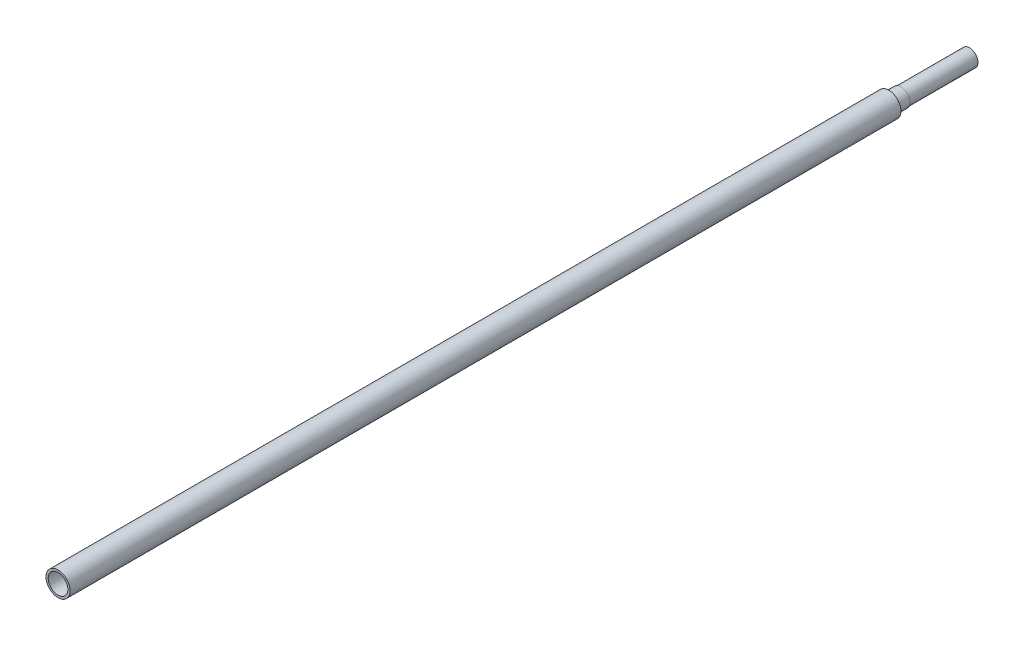
ISO-10303-21;
HEADER;
FILE_DESCRIPTION(('STEP AP214'),'2;1');
FILE_NAME('part.step','',(''),(''),'','','');
FILE_SCHEMA(('AUTOMOTIVE_DESIGN { 1 0 10303 214 1 1 1 1 }'));
ENDSEC;
DATA;
#1=APPLICATION_CONTEXT('core data for automotive mechanical design processes');
#2=APPLICATION_PROTOCOL_DEFINITION('international standard','automotive_design',2000,#1);
#3=PRODUCT_CONTEXT('',#1,'mechanical');
#4=PRODUCT('Part','Part','',(#3));
#5=PRODUCT_RELATED_PRODUCT_CATEGORY('part','',(#4));
#6=PRODUCT_DEFINITION_FORMATION('','',#4);
#7=PRODUCT_DEFINITION_CONTEXT('part definition',#1,'design');
#8=PRODUCT_DEFINITION('design','',#6,#7);
#9=PRODUCT_DEFINITION_SHAPE('','',#8);
#10=(LENGTH_UNIT() NAMED_UNIT(*) SI_UNIT(.MILLI.,.METRE.));
#11=(NAMED_UNIT(*) PLANE_ANGLE_UNIT() SI_UNIT($,.RADIAN.));
#12=(NAMED_UNIT(*) SI_UNIT($,.STERADIAN.) SOLID_ANGLE_UNIT());
#13=UNCERTAINTY_MEASURE_WITH_UNIT(LENGTH_MEASURE(1.E-05),#10,'distance_accuracy_value','');
#14=(GEOMETRIC_REPRESENTATION_CONTEXT(3) GLOBAL_UNCERTAINTY_ASSIGNED_CONTEXT((#13)) GLOBAL_UNIT_ASSIGNED_CONTEXT((#10,
#11,#12)) REPRESENTATION_CONTEXT('',''));
#15=CARTESIAN_POINT('',(0.,0.,0.));
#16=DIRECTION('',(0.,0.,1.));
#17=DIRECTION('',(1.,0.,0.));
#18=AXIS2_PLACEMENT_3D('',#15,#16,#17);
#19=CARTESIAN_POINT('',(0.,0.,57.));
#20=DIRECTION('',(0.,0.,-1.));
#21=DIRECTION('',(-1.,0.,0.));
#22=AXIS2_PLACEMENT_3D('',#19,#20,#21);
#23=CYLINDRICAL_SURFACE('',#22,7.);
#24=CARTESIAN_POINT('',(0.,0.,57.));
#25=DIRECTION('',(0.,0.,1.));
#26=DIRECTION('',(1.,0.,0.));
#27=AXIS2_PLACEMENT_3D('',#24,#25,#26);
#28=CIRCLE('',#27,7.);
#29=CARTESIAN_POINT('',(-7.,0.,57.));
#30=VERTEX_POINT('',#29);
#31=EDGE_CURVE('E11',#30,#30,#28,.T.);
#32=CARTESIAN_POINT('',(0.,0.,0.));
#33=DIRECTION('',(0.,0.,1.));
#34=DIRECTION('',(1.,0.,0.));
#35=AXIS2_PLACEMENT_3D('',#32,#33,#34);
#36=CIRCLE('',#35,7.);
#37=CARTESIAN_POINT('',(-7.,0.,0.));
#38=VERTEX_POINT('',#37);
#39=EDGE_CURVE('E48',#38,#38,#36,.T.);
#40=CARTESIAN_POINT('',(-7.,0.,57.));
#41=CARTESIAN_POINT('',(-7.,0.,56.40625));
#42=CARTESIAN_POINT('',(-7.,0.,55.8125));
#43=CARTESIAN_POINT('',(-7.,0.,54.625));
#44=CARTESIAN_POINT('',(-7.,0.,54.03125));
#45=CARTESIAN_POINT('',(-7.,0.,52.84375));
#46=CARTESIAN_POINT('',(-7.,0.,52.25));
#47=CARTESIAN_POINT('',(-7.,0.,51.0625));
#48=CARTESIAN_POINT('',(-7.,0.,50.46875));
#49=CARTESIAN_POINT('',(-7.,0.,49.28125));
#50=CARTESIAN_POINT('',(-7.,0.,48.6875));
#51=CARTESIAN_POINT('',(-7.,0.,47.5));
#52=CARTESIAN_POINT('',(-7.,0.,46.90625));
#53=CARTESIAN_POINT('',(-7.,0.,45.71875));
#54=CARTESIAN_POINT('',(-7.,0.,45.125));
#55=CARTESIAN_POINT('',(-7.,0.,43.9375));
#56=CARTESIAN_POINT('',(-7.,0.,43.34375));
#57=CARTESIAN_POINT('',(-7.,0.,42.15625));
#58=CARTESIAN_POINT('',(-7.,0.,41.5625));
#59=CARTESIAN_POINT('',(-7.,0.,40.375));
#60=CARTESIAN_POINT('',(-7.,0.,39.78125));
#61=CARTESIAN_POINT('',(-7.,0.,38.59375));
#62=CARTESIAN_POINT('',(-7.,0.,38.));
#63=CARTESIAN_POINT('',(-7.,0.,36.8125));
#64=CARTESIAN_POINT('',(-7.,0.,36.21875));
#65=CARTESIAN_POINT('',(-7.,0.,35.03125));
#66=CARTESIAN_POINT('',(-7.,0.,34.4375));
#67=CARTESIAN_POINT('',(-7.,0.,33.25));
#68=CARTESIAN_POINT('',(-7.,0.,32.65625));
#69=CARTESIAN_POINT('',(-7.,0.,31.46875));
#70=CARTESIAN_POINT('',(-7.,0.,30.875));
#71=CARTESIAN_POINT('',(-7.,0.,29.6875));
#72=CARTESIAN_POINT('',(-7.,0.,29.09375));
#73=CARTESIAN_POINT('',(-7.,0.,27.90625));
#74=CARTESIAN_POINT('',(-7.,0.,27.3125));
#75=CARTESIAN_POINT('',(-7.,0.,26.125));
#76=CARTESIAN_POINT('',(-7.,0.,25.53125));
#77=CARTESIAN_POINT('',(-7.,0.,24.34375));
#78=CARTESIAN_POINT('',(-7.,0.,23.75));
#79=CARTESIAN_POINT('',(-7.,0.,22.5625));
#80=CARTESIAN_POINT('',(-7.,0.,21.96875));
#81=CARTESIAN_POINT('',(-7.,0.,20.78125));
#82=CARTESIAN_POINT('',(-7.,0.,20.1875));
#83=CARTESIAN_POINT('',(-7.,0.,19.));
#84=CARTESIAN_POINT('',(-7.,0.,18.40625));
#85=CARTESIAN_POINT('',(-7.,0.,17.21875));
#86=CARTESIAN_POINT('',(-7.,0.,16.625));
#87=CARTESIAN_POINT('',(-7.,0.,15.4375));
#88=CARTESIAN_POINT('',(-7.,0.,14.84375));
#89=CARTESIAN_POINT('',(-7.,0.,13.65625));
#90=CARTESIAN_POINT('',(-7.,0.,13.0625));
#91=CARTESIAN_POINT('',(-7.,0.,11.875));
#92=CARTESIAN_POINT('',(-7.,0.,11.28125));
#93=CARTESIAN_POINT('',(-7.,0.,10.09375));
#94=CARTESIAN_POINT('',(-7.,0.,9.5));
#95=CARTESIAN_POINT('',(-7.,0.,8.3125));
#96=CARTESIAN_POINT('',(-7.,0.,7.71875));
#97=CARTESIAN_POINT('',(-7.,0.,6.53125));
#98=CARTESIAN_POINT('',(-7.,0.,5.9375));
#99=CARTESIAN_POINT('',(-7.,0.,4.75));
#100=CARTESIAN_POINT('',(-7.,0.,4.15625));
#101=CARTESIAN_POINT('',(-7.,0.,2.96875));
#102=CARTESIAN_POINT('',(-7.,0.,2.375));
#103=CARTESIAN_POINT('',(-7.,0.,1.1875));
#104=CARTESIAN_POINT('',(-7.,0.,0.593749999999999));
#105=CARTESIAN_POINT('',(-7.,0.,0.));
#106=B_SPLINE_CURVE_WITH_KNOTS('',3,(#40,#41,#42,#43,#44,#45,#46,#47,#48,#49,#50,#51,#52,#53,
#54,#55,#56,#57,#58,#59,#60,#61,#62,#63,#64,#65,#66,#67,#68,#69,#70,#71,#72,#73,#74,#75,#76,#77,
#78,#79,#80,#81,#82,#83,#84,#85,#86,#87,#88,#89,#90,#91,#92,#93,#94,#95,#96,#97,#98,#99,#100,
#101,#102,#103,#104,#105),.UNSPECIFIED.,.F.,.F.,(4,2,2,2,2,2,2,2,2,2,2,2,2,2,2,2,2,2,2,2,2,2,2,
2,2,2,2,2,2,2,2,2,4),(0.,1.78125,3.5625,5.34374999999999,7.12499999999999,8.90625,10.6875,
12.46875,14.25,16.03125,17.8125,19.59375,21.375,23.15625,24.9375,26.71875,28.5,30.28125,32.0625,
33.84375,35.625,37.40625,39.1875,40.96875,42.75,44.53125,46.3125,48.09375,49.875,51.65625,
53.4375,55.21875,57.),.UNSPECIFIED.);
#107=EDGE_CURVE('BSEAM41',#30,#38,#106,.T.);
#108=ORIENTED_EDGE('',*,*,#31,.F.);
#109=ORIENTED_EDGE('',*,*,#39,.T.);
#110=ORIENTED_EDGE('',*,*,#107,.T.);
#111=ORIENTED_EDGE('',*,*,#107,.F.);
#112=EDGE_LOOP('',(#108,#110,#109,#111));
#113=FACE_BOUND('',#112,.T.);
#114=ADVANCED_FACE('F41',(#113),#23,.T.);
#115=CARTESIAN_POINT('',(0.,0.,0.));
#116=DIRECTION('',(0.,0.,1.));
#117=DIRECTION('',(1.,0.,0.));
#118=AXIS2_PLACEMENT_3D('',#115,#116,#117);
#119=PLANE('',#118);
#120=ORIENTED_EDGE('',*,*,#39,.F.);
#121=EDGE_LOOP('',(#120));
#122=FACE_BOUND('',#121,.T.);
#123=ADVANCED_FACE('F62',(#122),#119,.F.);
#124=CARTESIAN_POINT('',(0.,0.,67.));
#125=DIRECTION('',(0.,0.,-1.));
#126=DIRECTION('',(-1.,0.,0.));
#127=AXIS2_PLACEMENT_3D('',#124,#125,#126);
#128=CYLINDRICAL_SURFACE('',#127,7.5);
#129=CARTESIAN_POINT('',(0.,0.,67.));
#130=DIRECTION('',(0.,0.,1.));
#131=DIRECTION('',(1.,0.,0.));
#132=AXIS2_PLACEMENT_3D('',#129,#130,#131);
#133=CIRCLE('',#132,7.5);
#134=CARTESIAN_POINT('',(7.5,0.,67.));
#135=VERTEX_POINT('',#134);
#136=EDGE_CURVE('E78',#135,#135,#133,.T.);
#137=ORIENTED_EDGE('',*,*,#136,.F.);
#138=EDGE_LOOP('',(#137));
#139=FACE_BOUND('',#138,.T.);
#140=CARTESIAN_POINT('',(0.,0.,57.));
#141=DIRECTION('',(0.,0.,1.));
#142=DIRECTION('',(1.,0.,0.));
#143=AXIS2_PLACEMENT_3D('',#140,#141,#142);
#144=CIRCLE('',#143,7.5);
#145=CARTESIAN_POINT('',(7.5,0.,57.));
#146=VERTEX_POINT('',#145);
#147=EDGE_CURVE('E76',#146,#146,#144,.T.);
#148=ORIENTED_EDGE('',*,*,#147,.T.);
#149=EDGE_LOOP('',(#148));
#150=FACE_BOUND('',#149,.T.);
#151=ADVANCED_FACE('F68',(#139,#150),#128,.T.);
#152=CARTESIAN_POINT('',(0.,0.,57.));
#153=DIRECTION('',(0.,0.,1.));
#154=DIRECTION('',(1.,0.,0.));
#155=AXIS2_PLACEMENT_3D('',#152,#153,#154);
#156=PLANE('',#155);
#157=ORIENTED_EDGE('',*,*,#31,.T.);
#158=EDGE_LOOP('',(#157));
#159=FACE_BOUND('',#158,.T.);
#160=ORIENTED_EDGE('',*,*,#147,.F.);
#161=EDGE_LOOP('',(#160));
#162=FACE_BOUND('',#161,.T.);
#163=ADVANCED_FACE('F102',(#159,#162),#156,.F.);
#164=CARTESIAN_POINT('',(0.,0.,757.));
#165=DIRECTION('',(0.,0.,-1.));
#166=DIRECTION('',(-1.,0.,0.));
#167=AXIS2_PLACEMENT_3D('',#164,#165,#166);
#168=CYLINDRICAL_SURFACE('',#167,10.);
#169=CARTESIAN_POINT('',(0.,0.,757.));
#170=DIRECTION('',(0.,0.,1.));
#171=DIRECTION('',(1.,0.,0.));
#172=AXIS2_PLACEMENT_3D('',#169,#170,#171);
#173=CIRCLE('',#172,10.);
#174=CARTESIAN_POINT('',(10.,0.,757.));
#175=VERTEX_POINT('',#174);
#176=EDGE_CURVE('E85',#175,#175,#173,.T.);
#177=ORIENTED_EDGE('',*,*,#176,.F.);
#178=EDGE_LOOP('',(#177));
#179=FACE_BOUND('',#178,.T.);
#180=CARTESIAN_POINT('',(0.,0.,67.));
#181=DIRECTION('',(0.,0.,1.));
#182=DIRECTION('',(1.,0.,0.));
#183=AXIS2_PLACEMENT_3D('',#180,#181,#182);
#184=CIRCLE('',#183,10.);
#185=CARTESIAN_POINT('',(10.,0.,67.));
#186=VERTEX_POINT('',#185);
#187=EDGE_CURVE('E81',#186,#186,#184,.T.);
#188=ORIENTED_EDGE('',*,*,#187,.T.);
#189=EDGE_LOOP('',(#188));
#190=FACE_BOUND('',#189,.T.);
#191=ADVANCED_FACE('F98',(#179,#190),#168,.T.);
#192=CARTESIAN_POINT('',(0.,0.,757.));
#193=DIRECTION('',(0.,0.,1.));
#194=DIRECTION('',(1.,0.,0.));
#195=AXIS2_PLACEMENT_3D('',#192,#193,#194);
#196=PLANE('',#195);
#197=CARTESIAN_POINT('',(0.,0.,757.));
#198=DIRECTION('',(0.,0.,1.));
#199=DIRECTION('',(1.,0.,0.));
#200=AXIS2_PLACEMENT_3D('',#197,#198,#199);
#201=CIRCLE('',#200,8.14556697077009);
#202=CARTESIAN_POINT('',(8.14556697077009,0.,757.));
#203=VERTEX_POINT('',#202);
#204=EDGE_CURVE('E42',#203,#203,#201,.F.);
#205=ORIENTED_EDGE('',*,*,#204,.T.);
#206=EDGE_LOOP('',(#205));
#207=FACE_BOUND('',#206,.T.);
#208=ORIENTED_EDGE('',*,*,#176,.T.);
#209=EDGE_LOOP('',(#208));
#210=FACE_BOUND('',#209,.T.);
#211=ADVANCED_FACE('F94',(#207,#210),#196,.T.);
#212=CARTESIAN_POINT('',(0.,0.,67.));
#213=DIRECTION('',(0.,0.,1.));
#214=DIRECTION('',(1.,0.,0.));
#215=AXIS2_PLACEMENT_3D('',#212,#213,#214);
#216=PLANE('',#215);
#217=ORIENTED_EDGE('',*,*,#136,.T.);
#218=EDGE_LOOP('',(#217));
#219=FACE_BOUND('',#218,.T.);
#220=ORIENTED_EDGE('',*,*,#187,.F.);
#221=EDGE_LOOP('',(#220));
#222=FACE_BOUND('',#221,.T.);
#223=ADVANCED_FACE('F58',(#219,#222),#216,.F.);
#224=CARTESIAN_POINT('',(0.,0.,772.393436229871));
#225=DIRECTION('',(0.,0.,1.));
#226=DIRECTION('',(1.,0.,0.));
#227=AXIS2_PLACEMENT_3D('',#224,#225,#226);
#228=CYLINDRICAL_SURFACE('',#227,8.14556697077009);
#229=ORIENTED_EDGE('',*,*,#204,.F.);
#230=EDGE_LOOP('',(#229));
#231=FACE_BOUND('',#230,.T.);
#232=CARTESIAN_POINT('',(0.,0.,738.304335199379));
#233=DIRECTION('',(0.,0.,1.));
#234=DIRECTION('',(1.,0.,0.));
#235=AXIS2_PLACEMENT_3D('',#232,#233,#234);
#236=CIRCLE('',#235,8.14556697077009);
#237=CARTESIAN_POINT('',(8.14556697077009,0.,738.304335199379));
#238=VERTEX_POINT('',#237);
#239=EDGE_CURVE('E90',#238,#238,#236,.T.);
#240=ORIENTED_EDGE('',*,*,#239,.F.);
#241=EDGE_LOOP('',(#240));
#242=FACE_BOUND('',#241,.T.);
#243=ADVANCED_FACE('F53',(#231,#242),#228,.F.);
#244=CARTESIAN_POINT('',(0.,0.,733.601489916103));
#245=DIRECTION('',(0.,0.,1.));
#246=DIRECTION('',(1.,0.,0.));
#247=AXIS2_PLACEMENT_3D('',#244,#245,#246);
#248=CONICAL_SURFACE('',#247,0.,1.04719755119661);
#249=ORIENTED_EDGE('',*,*,#239,.T.);
#250=EDGE_LOOP('',(#249));
#251=FACE_BOUND('',#250,.T.);
#252=CARTESIAN_POINT('',(0.,0.,733.601489916103));
#253=VERTEX_POINT('',#252);
#254=VERTEX_LOOP('',#253);
#255=FACE_BOUND('',#254,.T.);
#256=ADVANCED_FACE('F55',(#251,#255),#248,.F.);
#257=CLOSED_SHELL('',(#114,#123,#151,#163,#191,#211,#223,#243,#256));
#258=MANIFOLD_SOLID_BREP('B2',#257);
#259=ADVANCED_BREP_SHAPE_REPRESENTATION('',(#18,#258),#14);
#260=SHAPE_DEFINITION_REPRESENTATION(#9,#259);
ENDSEC;
END-ISO-10303-21;
